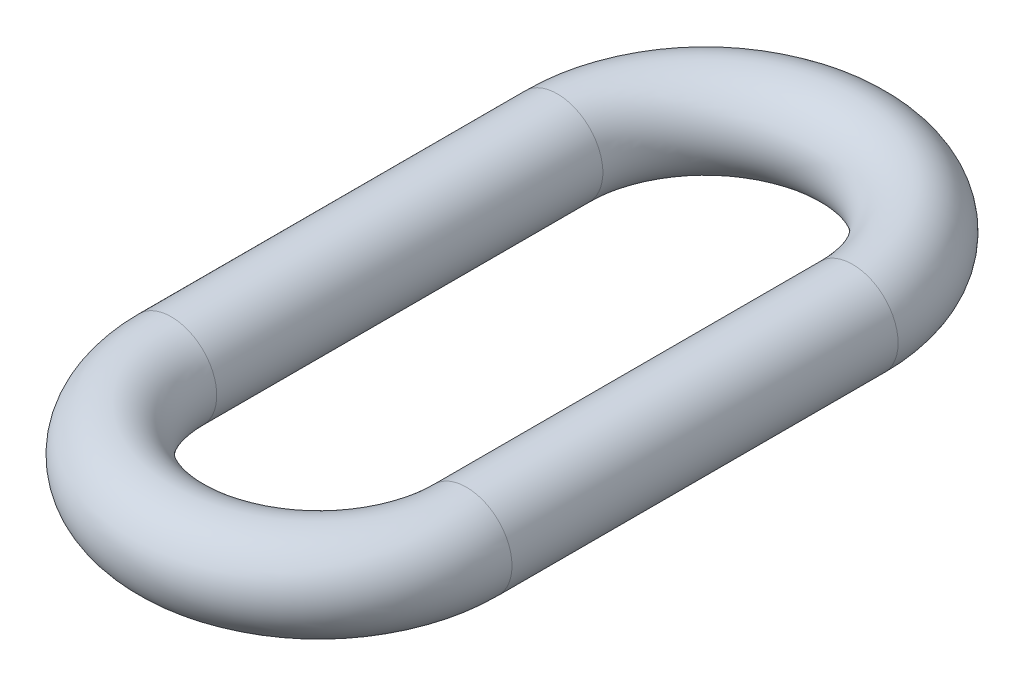
ISO-10303-21;
HEADER;
FILE_DESCRIPTION(('STEP AP214'),'2;1');
FILE_NAME('part.step','',(''),(''),'','','');
FILE_SCHEMA(('AUTOMOTIVE_DESIGN { 1 0 10303 214 1 1 1 1 }'));
ENDSEC;
DATA;
#1=APPLICATION_CONTEXT('core data for automotive mechanical design processes');
#2=APPLICATION_PROTOCOL_DEFINITION('international standard','automotive_design',2000,#1);
#3=PRODUCT_CONTEXT('',#1,'mechanical');
#4=PRODUCT('Part','Part','',(#3));
#5=PRODUCT_RELATED_PRODUCT_CATEGORY('part','',(#4));
#6=PRODUCT_DEFINITION_FORMATION('','',#4);
#7=PRODUCT_DEFINITION_CONTEXT('part definition',#1,'design');
#8=PRODUCT_DEFINITION('design','',#6,#7);
#9=PRODUCT_DEFINITION_SHAPE('','',#8);
#10=(LENGTH_UNIT() NAMED_UNIT(*) SI_UNIT(.MILLI.,.METRE.));
#11=(NAMED_UNIT(*) PLANE_ANGLE_UNIT() SI_UNIT($,.RADIAN.));
#12=(NAMED_UNIT(*) SI_UNIT($,.STERADIAN.) SOLID_ANGLE_UNIT());
#13=UNCERTAINTY_MEASURE_WITH_UNIT(LENGTH_MEASURE(1.E-05),#10,'distance_accuracy_value','');
#14=(GEOMETRIC_REPRESENTATION_CONTEXT(3) GLOBAL_UNCERTAINTY_ASSIGNED_CONTEXT((#13)) GLOBAL_UNIT_ASSIGNED_CONTEXT((#10,
#11,#12)) REPRESENTATION_CONTEXT('',''));
#15=CARTESIAN_POINT('',(0.,0.,0.));
#16=DIRECTION('',(0.,0.,1.));
#17=DIRECTION('',(1.,0.,0.));
#18=AXIS2_PLACEMENT_3D('',#15,#16,#17);
#19=CARTESIAN_POINT('',(-8.255,0.,21.59));
#20=DIRECTION('',(0.,1.,0.));
#21=DIRECTION('',(1.,0.,0.));
#22=AXIS2_PLACEMENT_3D('',#19,#20,#21);
#23=TOROIDAL_SURFACE('',#22,8.255,2.54);
#24=CARTESIAN_POINT('',(-16.51,0.,21.59));
#25=DIRECTION('',(0.,0.,-1.));
#26=DIRECTION('',(0.,-1.,0.));
#27=AXIS2_PLACEMENT_3D('',#24,#25,#26);
#28=CIRCLE('',#27,2.54);
#29=CARTESIAN_POINT('',(-19.05,0.,21.59));
#30=VERTEX_POINT('',#29);
#31=EDGE_CURVE('E9',#30,#30,#28,.T.);
#32=CARTESIAN_POINT('',(0.,0.,21.59));
#33=DIRECTION('',(0.,0.,-1.));
#34=DIRECTION('',(0.,-1.,0.));
#35=AXIS2_PLACEMENT_3D('',#32,#33,#34);
#36=CIRCLE('',#35,2.54);
#37=CARTESIAN_POINT('',(2.54,0.,21.59));
#38=VERTEX_POINT('',#37);
#39=EDGE_CURVE('E28',#38,#38,#36,.T.);
#40=CARTESIAN_POINT('',(-8.255,0.,21.59));
#41=DIRECTION('',(0.,1.,0.));
#42=DIRECTION('',(1.,0.,0.));
#43=AXIS2_PLACEMENT_3D('',#40,#41,#42);
#44=CIRCLE('',#43,10.795);
#45=EDGE_CURVE('',#30,#38,#44,.T.);
#46=ORIENTED_EDGE('',*,*,#31,.F.);
#47=ORIENTED_EDGE('',*,*,#39,.F.);
#48=ORIENTED_EDGE('',*,*,#45,.T.);
#49=ORIENTED_EDGE('',*,*,#45,.F.);
#50=EDGE_LOOP('',(#46,#48,#47,#49));
#51=FACE_BOUND('',#50,.T.);
#52=ADVANCED_FACE('F14',(#51),#23,.T.);
#53=CARTESIAN_POINT('',(-16.51,0.,0.));
#54=DIRECTION('',(0.,0.,1.));
#55=DIRECTION('',(1.,0.,0.));
#56=AXIS2_PLACEMENT_3D('',#53,#54,#55);
#57=CYLINDRICAL_SURFACE('',#56,2.54);
#58=ORIENTED_EDGE('',*,*,#31,.T.);
#59=EDGE_LOOP('',(#58));
#60=FACE_BOUND('',#59,.T.);
#61=CARTESIAN_POINT('',(-16.51,0.,0.));
#62=DIRECTION('',(0.,0.,-1.));
#63=DIRECTION('',(0.,-1.,0.));
#64=AXIS2_PLACEMENT_3D('',#61,#62,#63);
#65=CIRCLE('',#64,2.54);
#66=CARTESIAN_POINT('',(-19.05,0.,0.));
#67=VERTEX_POINT('',#66);
#68=EDGE_CURVE('E22',#67,#67,#65,.T.);
#69=ORIENTED_EDGE('',*,*,#68,.F.);
#70=EDGE_LOOP('',(#69));
#71=FACE_BOUND('',#70,.T.);
#72=ADVANCED_FACE('F38',(#60,#71),#57,.T.);
#73=CARTESIAN_POINT('',(-8.255,0.,0.));
#74=DIRECTION('',(0.,1.,0.));
#75=DIRECTION('',(1.,0.,0.));
#76=AXIS2_PLACEMENT_3D('',#73,#74,#75);
#77=TOROIDAL_SURFACE('',#76,8.255,2.54);
#78=CARTESIAN_POINT('',(0.,0.,0.));
#79=DIRECTION('',(0.,0.,1.));
#80=DIRECTION('',(1.,0.,0.));
#81=AXIS2_PLACEMENT_3D('',#78,#79,#80);
#82=CIRCLE('',#81,2.54);
#83=CARTESIAN_POINT('',(2.54,0.,0.));
#84=VERTEX_POINT('',#83);
#85=EDGE_CURVE('E18',#84,#84,#82,.T.);
#86=CARTESIAN_POINT('',(-8.255,0.,0.));
#87=DIRECTION('',(0.,1.,0.));
#88=DIRECTION('',(1.,0.,0.));
#89=AXIS2_PLACEMENT_3D('',#86,#87,#88);
#90=CIRCLE('',#89,10.795);
#91=EDGE_CURVE('',#84,#67,#90,.T.);
#92=ORIENTED_EDGE('',*,*,#85,.F.);
#93=ORIENTED_EDGE('',*,*,#68,.T.);
#94=ORIENTED_EDGE('',*,*,#91,.T.);
#95=ORIENTED_EDGE('',*,*,#91,.F.);
#96=EDGE_LOOP('',(#92,#94,#93,#95));
#97=FACE_BOUND('',#96,.T.);
#98=ADVANCED_FACE('F36',(#97),#77,.T.);
#99=CARTESIAN_POINT('',(0.,0.,21.59));
#100=DIRECTION('',(0.,0.,-1.));
#101=DIRECTION('',(0.,-1.,0.));
#102=AXIS2_PLACEMENT_3D('',#99,#100,#101);
#103=CYLINDRICAL_SURFACE('',#102,2.54);
#104=ORIENTED_EDGE('',*,*,#85,.T.);
#105=EDGE_LOOP('',(#104));
#106=FACE_BOUND('',#105,.T.);
#107=ORIENTED_EDGE('',*,*,#39,.T.);
#108=EDGE_LOOP('',(#107));
#109=FACE_BOUND('',#108,.T.);
#110=ADVANCED_FACE('F16',(#106,#109),#103,.T.);
#111=CLOSED_SHELL('',(#52,#72,#98,#110));
#112=MANIFOLD_SOLID_BREP('B1',#111);
#113=ADVANCED_BREP_SHAPE_REPRESENTATION('',(#18,#112),#14);
#114=SHAPE_DEFINITION_REPRESENTATION(#9,#113);
ENDSEC;
END-ISO-10303-21;
